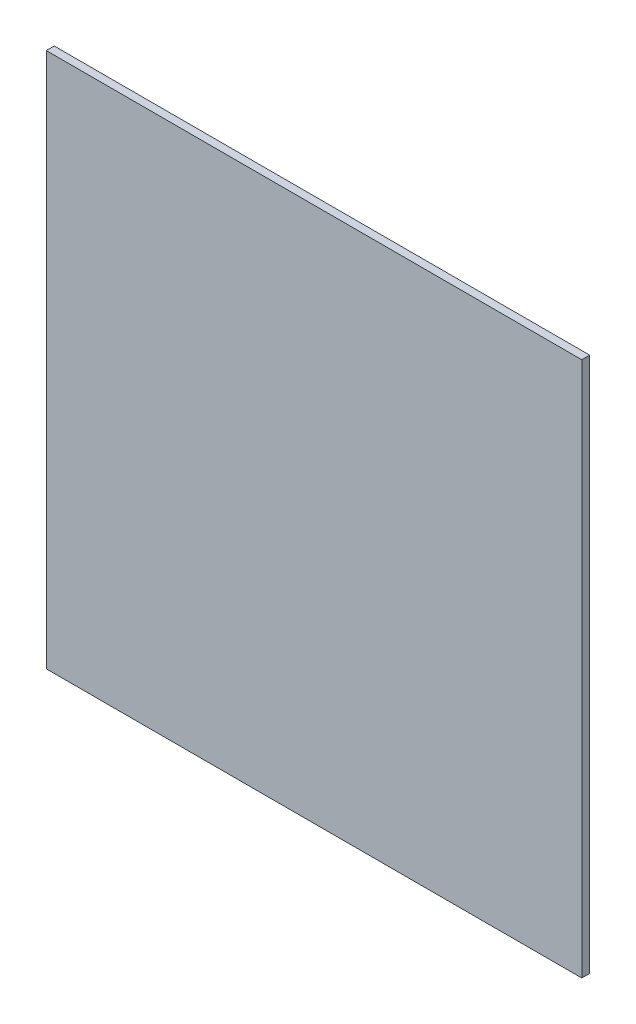
ISO-10303-21;
HEADER;
FILE_DESCRIPTION(('STEP AP214'),'2;1');
FILE_NAME('part.step','',(''),(''),'','','');
FILE_SCHEMA(('AUTOMOTIVE_DESIGN { 1 0 10303 214 1 1 1 1 }'));
ENDSEC;
DATA;
#1=APPLICATION_CONTEXT('core data for automotive mechanical design processes');
#2=APPLICATION_PROTOCOL_DEFINITION('international standard','automotive_design',2000,#1);
#3=PRODUCT_CONTEXT('',#1,'mechanical');
#4=PRODUCT('Part','Part','',(#3));
#5=PRODUCT_RELATED_PRODUCT_CATEGORY('part','',(#4));
#6=PRODUCT_DEFINITION_FORMATION('','',#4);
#7=PRODUCT_DEFINITION_CONTEXT('part definition',#1,'design');
#8=PRODUCT_DEFINITION('design','',#6,#7);
#9=PRODUCT_DEFINITION_SHAPE('','',#8);
#10=(LENGTH_UNIT() NAMED_UNIT(*) SI_UNIT(.MILLI.,.METRE.));
#11=(NAMED_UNIT(*) PLANE_ANGLE_UNIT() SI_UNIT($,.RADIAN.));
#12=(NAMED_UNIT(*) SI_UNIT($,.STERADIAN.) SOLID_ANGLE_UNIT());
#13=UNCERTAINTY_MEASURE_WITH_UNIT(LENGTH_MEASURE(1.E-05),#10,'distance_accuracy_value','');
#14=(GEOMETRIC_REPRESENTATION_CONTEXT(3) GLOBAL_UNCERTAINTY_ASSIGNED_CONTEXT((#13)) GLOBAL_UNIT_ASSIGNED_CONTEXT((#10,
#11,#12)) REPRESENTATION_CONTEXT('',''));
#15=CARTESIAN_POINT('',(0.,0.,0.));
#16=DIRECTION('',(0.,0.,1.));
#17=DIRECTION('',(1.,0.,0.));
#18=AXIS2_PLACEMENT_3D('',#15,#16,#17);
#19=CARTESIAN_POINT('',(0.,0.,1.25));
#20=DIRECTION('',(0.,0.,1.));
#21=DIRECTION('',(1.,0.,0.));
#22=AXIS2_PLACEMENT_3D('',#19,#20,#21);
#23=PLANE('',#22);
#24=DIRECTION('',(0.,1.,0.));
#25=VECTOR('',#24,1.);
#26=CARTESIAN_POINT('',(0.675,0.675,1.25));
#27=LINE('',#26,#25);
#28=CARTESIAN_POINT('',(0.675,0.675,1.25));
#29=VERTEX_POINT('',#28);
#30=CARTESIAN_POINT('',(0.675,-0.675,1.25));
#31=VERTEX_POINT('',#30);
#32=EDGE_CURVE('E55',#29,#31,#27,.F.);
#33=ORIENTED_EDGE('',*,*,#32,.F.);
#34=DIRECTION('',(1.,0.,0.));
#35=VECTOR('',#34,1.);
#36=CARTESIAN_POINT('',(1.05,0.675,1.25));
#37=LINE('',#36,#35);
#38=CARTESIAN_POINT('',(-0.675,0.675,1.25));
#39=VERTEX_POINT('',#38);
#40=EDGE_CURVE('E67',#39,#29,#37,.T.);
#41=ORIENTED_EDGE('',*,*,#40,.F.);
#42=DIRECTION('',(0.,1.,0.));
#43=VECTOR('',#42,1.);
#44=CARTESIAN_POINT('',(-0.675,-0.675,1.25));
#45=LINE('',#44,#43);
#46=CARTESIAN_POINT('',(-0.675,-0.675,1.25));
#47=VERTEX_POINT('',#46);
#48=EDGE_CURVE('E20',#47,#39,#45,.T.);
#49=ORIENTED_EDGE('',*,*,#48,.F.);
#50=DIRECTION('',(1.,0.,0.));
#51=VECTOR('',#50,1.);
#52=CARTESIAN_POINT('',(-1.05,-0.675,1.25));
#53=LINE('',#52,#51);
#54=EDGE_CURVE('E81',#31,#47,#53,.F.);
#55=ORIENTED_EDGE('',*,*,#54,.F.);
#56=EDGE_LOOP('',(#33,#41,#49,#55));
#57=FACE_BOUND('',#56,.T.);
#58=ADVANCED_FACE('F17',(#57),#23,.T.);
#59=CARTESIAN_POINT('',(-0.675,-0.675,1.25));
#60=DIRECTION('',(-1.,0.,0.));
#61=DIRECTION('',(0.,0.,1.));
#62=AXIS2_PLACEMENT_3D('',#59,#60,#61);
#63=PLANE('',#62);
#64=DIRECTION('',(0.,1.,0.));
#65=VECTOR('',#64,1.);
#66=CARTESIAN_POINT('',(-0.675,0.,1.23));
#67=LINE('',#66,#65);
#68=CARTESIAN_POINT('',(-0.675,-0.675,1.23));
#69=VERTEX_POINT('',#68);
#70=CARTESIAN_POINT('',(-0.675,0.675,1.23));
#71=VERTEX_POINT('',#70);
#72=EDGE_CURVE('E83',#69,#71,#67,.T.);
#73=ORIENTED_EDGE('',*,*,#72,.F.);
#74=DIRECTION('',(0.,0.,-1.));
#75=VECTOR('',#74,1.);
#76=CARTESIAN_POINT('',(-0.675,-0.675,0.));
#77=LINE('',#76,#75);
#78=EDGE_CURVE('E65',#47,#69,#77,.T.);
#79=ORIENTED_EDGE('',*,*,#78,.F.);
#80=ORIENTED_EDGE('',*,*,#48,.T.);
#81=DIRECTION('',(0.,0.,1.));
#82=VECTOR('',#81,1.);
#83=CARTESIAN_POINT('',(-0.675,0.675,0.));
#84=LINE('',#83,#82);
#85=EDGE_CURVE('E62',#71,#39,#84,.T.);
#86=ORIENTED_EDGE('',*,*,#85,.F.);
#87=EDGE_LOOP('',(#73,#79,#80,#86));
#88=FACE_BOUND('',#87,.T.);
#89=ADVANCED_FACE('F60',(#88),#63,.T.);
#90=CARTESIAN_POINT('',(1.05,0.675,0.));
#91=DIRECTION('',(0.,1.,0.));
#92=DIRECTION('',(0.,0.,1.));
#93=AXIS2_PLACEMENT_3D('',#90,#91,#92);
#94=PLANE('',#93);
#95=DIRECTION('',(0.,0.,-1.));
#96=VECTOR('',#95,1.);
#97=CARTESIAN_POINT('',(0.675,0.675,1.25));
#98=LINE('',#97,#96);
#99=CARTESIAN_POINT('',(0.675,0.675,1.23));
#100=VERTEX_POINT('',#99);
#101=EDGE_CURVE('E77',#100,#29,#98,.F.);
#102=ORIENTED_EDGE('',*,*,#101,.F.);
#103=DIRECTION('',(-1.,0.,0.));
#104=VECTOR('',#103,1.);
#105=CARTESIAN_POINT('',(0.,0.675,1.23));
#106=LINE('',#105,#104);
#107=EDGE_CURVE('E73',#71,#100,#106,.F.);
#108=ORIENTED_EDGE('',*,*,#107,.F.);
#109=ORIENTED_EDGE('',*,*,#85,.T.);
#110=ORIENTED_EDGE('',*,*,#40,.T.);
#111=EDGE_LOOP('',(#102,#108,#109,#110));
#112=FACE_BOUND('',#111,.T.);
#113=ADVANCED_FACE('F71',(#112),#94,.T.);
#114=CARTESIAN_POINT('',(0.675,0.675,1.25));
#115=DIRECTION('',(1.,0.,0.));
#116=DIRECTION('',(0.,0.,-1.));
#117=AXIS2_PLACEMENT_3D('',#114,#115,#116);
#118=PLANE('',#117);
#119=DIRECTION('',(0.,1.,0.));
#120=VECTOR('',#119,1.);
#121=CARTESIAN_POINT('',(0.675,0.,1.23));
#122=LINE('',#121,#120);
#123=CARTESIAN_POINT('',(0.675,-0.675,1.23));
#124=VERTEX_POINT('',#123);
#125=EDGE_CURVE('E26',#100,#124,#122,.F.);
#126=ORIENTED_EDGE('',*,*,#125,.F.);
#127=ORIENTED_EDGE('',*,*,#101,.T.);
#128=ORIENTED_EDGE('',*,*,#32,.T.);
#129=DIRECTION('',(0.,0.,-1.));
#130=VECTOR('',#129,1.);
#131=CARTESIAN_POINT('',(0.675,-0.675,0.));
#132=LINE('',#131,#130);
#133=EDGE_CURVE('E35',#124,#31,#132,.F.);
#134=ORIENTED_EDGE('',*,*,#133,.F.);
#135=EDGE_LOOP('',(#126,#127,#128,#134));
#136=FACE_BOUND('',#135,.T.);
#137=ADVANCED_FACE('F89',(#136),#118,.T.);
#138=CARTESIAN_POINT('',(-1.05,-0.675,0.));
#139=DIRECTION('',(0.,-1.,0.));
#140=DIRECTION('',(0.,0.,-1.));
#141=AXIS2_PLACEMENT_3D('',#138,#139,#140);
#142=PLANE('',#141);
#143=ORIENTED_EDGE('',*,*,#133,.T.);
#144=ORIENTED_EDGE('',*,*,#54,.T.);
#145=ORIENTED_EDGE('',*,*,#78,.T.);
#146=DIRECTION('',(-1.,0.,0.));
#147=VECTOR('',#146,1.);
#148=CARTESIAN_POINT('',(0.,-0.675,1.23));
#149=LINE('',#148,#147);
#150=EDGE_CURVE('E11',#124,#69,#149,.T.);
#151=ORIENTED_EDGE('',*,*,#150,.F.);
#152=EDGE_LOOP('',(#143,#144,#145,#151));
#153=FACE_BOUND('',#152,.T.);
#154=ADVANCED_FACE('F91',(#153),#142,.T.);
#155=CARTESIAN_POINT('',(0.,0.,1.23));
#156=DIRECTION('',(0.,0.,-1.));
#157=DIRECTION('',(-1.,0.,0.));
#158=AXIS2_PLACEMENT_3D('',#155,#156,#157);
#159=PLANE('',#158);
#160=ORIENTED_EDGE('',*,*,#125,.T.);
#161=ORIENTED_EDGE('',*,*,#150,.T.);
#162=ORIENTED_EDGE('',*,*,#72,.T.);
#163=ORIENTED_EDGE('',*,*,#107,.T.);
#164=EDGE_LOOP('',(#160,#161,#162,#163));
#165=FACE_BOUND('',#164,.T.);
#166=ADVANCED_FACE('F88',(#165),#159,.T.);
#167=CLOSED_SHELL('',(#58,#89,#113,#137,#154,#166));
#168=MANIFOLD_SOLID_BREP('B1',#167);
#169=ADVANCED_BREP_SHAPE_REPRESENTATION('',(#18,#168),#14);
#170=SHAPE_DEFINITION_REPRESENTATION(#9,#169);
ENDSEC;
END-ISO-10303-21;
